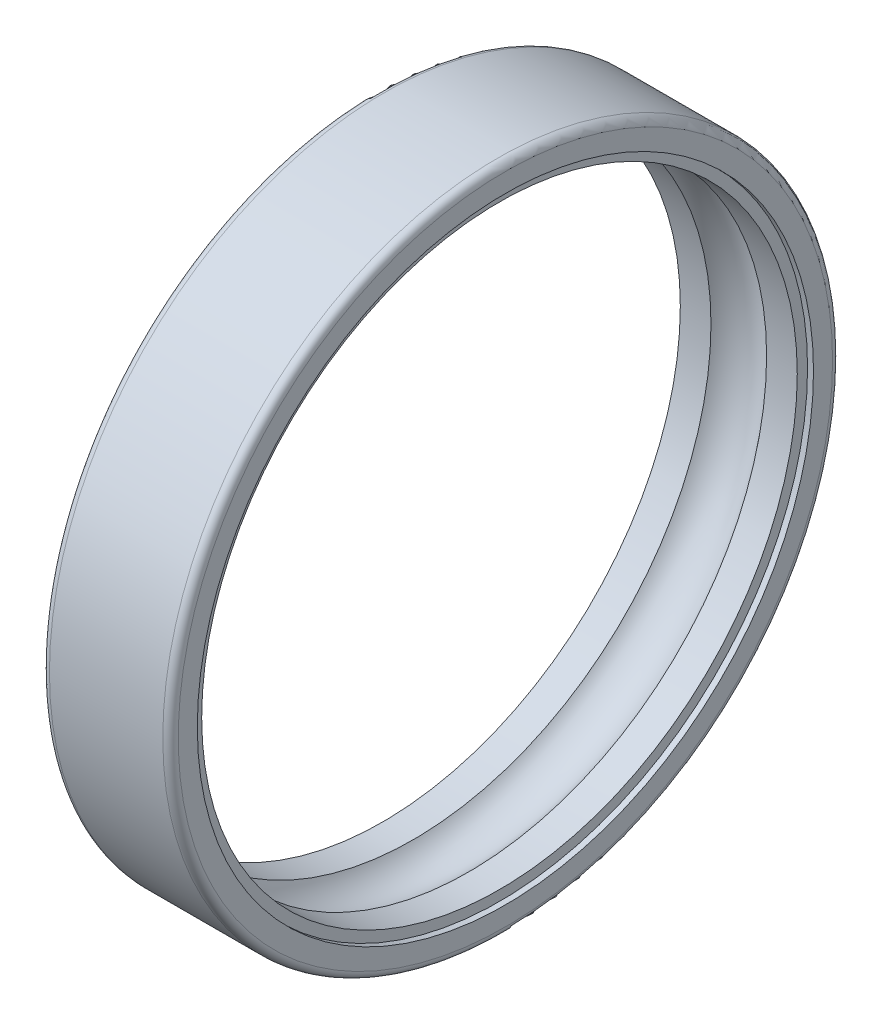
ISO-10303-21;
HEADER;
FILE_DESCRIPTION(('STEP AP214'),'2;1');
FILE_NAME('part.step','',(''),(''),'','','');
FILE_SCHEMA(('AUTOMOTIVE_DESIGN { 1 0 10303 214 1 1 1 1 }'));
ENDSEC;
DATA;
#1=APPLICATION_CONTEXT('core data for automotive mechanical design processes');
#2=APPLICATION_PROTOCOL_DEFINITION('international standard','automotive_design',2000,#1);
#3=PRODUCT_CONTEXT('',#1,'mechanical');
#4=PRODUCT('Part','Part','',(#3));
#5=PRODUCT_RELATED_PRODUCT_CATEGORY('part','',(#4));
#6=PRODUCT_DEFINITION_FORMATION('','',#4);
#7=PRODUCT_DEFINITION_CONTEXT('part definition',#1,'design');
#8=PRODUCT_DEFINITION('design','',#6,#7);
#9=PRODUCT_DEFINITION_SHAPE('','',#8);
#10=(LENGTH_UNIT() NAMED_UNIT(*) SI_UNIT(.MILLI.,.METRE.));
#11=(NAMED_UNIT(*) PLANE_ANGLE_UNIT() SI_UNIT($,.RADIAN.));
#12=(NAMED_UNIT(*) SI_UNIT($,.STERADIAN.) SOLID_ANGLE_UNIT());
#13=UNCERTAINTY_MEASURE_WITH_UNIT(LENGTH_MEASURE(1.E-05),#10,'distance_accuracy_value','');
#14=(GEOMETRIC_REPRESENTATION_CONTEXT(3) GLOBAL_UNCERTAINTY_ASSIGNED_CONTEXT((#13)) GLOBAL_UNIT_ASSIGNED_CONTEXT((#10,
#11,#12)) REPRESENTATION_CONTEXT('',''));
#15=CARTESIAN_POINT('',(0.,0.,0.));
#16=DIRECTION('',(0.,0.,1.));
#17=DIRECTION('',(1.,0.,0.));
#18=AXIS2_PLACEMENT_3D('',#15,#16,#17);
#19=CARTESIAN_POINT('',(0.23,11.425,0.));
#20=DIRECTION('',(1.,0.,0.));
#21=DIRECTION('',(0.,1.,0.));
#22=AXIS2_PLACEMENT_3D('',#19,#20,#21);
#23=PLANE('',#22);
#24=CARTESIAN_POINT('',(0.23,0.,0.));
#25=DIRECTION('',(1.,0.,0.));
#26=DIRECTION('',(0.,0.,-1.));
#27=AXIS2_PLACEMENT_3D('',#24,#25,#26);
#28=CIRCLE('',#27,11.56);
#29=CARTESIAN_POINT('',(0.23,0.,-11.56));
#30=VERTEX_POINT('',#29);
#31=EDGE_CURVE('E46',#30,#30,#28,.T.);
#32=ORIENTED_EDGE('',*,*,#31,.T.);
#33=EDGE_LOOP('',(#32));
#34=FACE_BOUND('',#33,.T.);
#35=CARTESIAN_POINT('',(0.23,0.,0.));
#36=DIRECTION('',(1.,0.,0.));
#37=DIRECTION('',(0.,0.,-1.));
#38=AXIS2_PLACEMENT_3D('',#35,#36,#37);
#39=CIRCLE('',#38,11.960005);
#40=CARTESIAN_POINT('',(0.23,0.,-11.960005));
#41=VERTEX_POINT('',#40);
#42=EDGE_CURVE('E10',#41,#41,#39,.T.);
#43=ORIENTED_EDGE('',*,*,#42,.F.);
#44=EDGE_LOOP('',(#43));
#45=FACE_BOUND('',#44,.T.);
#46=ADVANCED_FACE('F15',(#34,#45),#23,.F.);
#47=CARTESIAN_POINT('',(5.,0.,0.));
#48=DIRECTION('',(1.,0.,0.));
#49=DIRECTION('',(0.,0.,-1.));
#50=AXIS2_PLACEMENT_3D('',#47,#48,#49);
#51=CYLINDRICAL_SURFACE('',#50,11.960005);
#52=ORIENTED_EDGE('',*,*,#42,.T.);
#53=EDGE_LOOP('',(#52));
#54=FACE_BOUND('',#53,.T.);
#55=CARTESIAN_POINT('',(0.,0.,0.));
#56=DIRECTION('',(1.,0.,0.));
#57=DIRECTION('',(0.,0.,-1.));
#58=AXIS2_PLACEMENT_3D('',#55,#56,#57);
#59=CIRCLE('',#58,11.960005);
#60=CARTESIAN_POINT('',(0.,0.,-11.960005));
#61=VERTEX_POINT('',#60);
#62=EDGE_CURVE('E65',#61,#61,#59,.T.);
#63=ORIENTED_EDGE('',*,*,#62,.F.);
#64=EDGE_LOOP('',(#63));
#65=FACE_BOUND('',#64,.T.);
#66=ADVANCED_FACE('F17',(#54,#65),#51,.F.);
#67=CARTESIAN_POINT('',(5.,0.,0.));
#68=DIRECTION('',(1.,0.,0.));
#69=DIRECTION('',(0.,0.,-1.));
#70=AXIS2_PLACEMENT_3D('',#67,#68,#69);
#71=CYLINDRICAL_SURFACE('',#70,11.56);
#72=CARTESIAN_POINT('',(4.77,0.,0.));
#73=DIRECTION('',(-1.,0.,0.));
#74=DIRECTION('',(0.,0.,1.));
#75=AXIS2_PLACEMENT_3D('',#72,#73,#74);
#76=CIRCLE('',#75,11.56);
#77=CARTESIAN_POINT('',(4.77,0.,11.56));
#78=VERTEX_POINT('',#77);
#79=EDGE_CURVE('E42',#78,#78,#76,.T.);
#80=ORIENTED_EDGE('',*,*,#79,.F.);
#81=EDGE_LOOP('',(#80));
#82=FACE_BOUND('',#81,.T.);
#83=CARTESIAN_POINT('',(3.58,0.,0.));
#84=DIRECTION('',(1.,0.,0.));
#85=DIRECTION('',(0.,0.,-1.));
#86=AXIS2_PLACEMENT_3D('',#83,#84,#85);
#87=CIRCLE('',#86,11.56);
#88=CARTESIAN_POINT('',(3.58,0.,-11.56));
#89=VERTEX_POINT('',#88);
#90=EDGE_CURVE('E19',#89,#89,#87,.T.);
#91=ORIENTED_EDGE('',*,*,#90,.F.);
#92=EDGE_LOOP('',(#91));
#93=FACE_BOUND('',#92,.T.);
#94=ADVANCED_FACE('F111',(#82,#93),#71,.F.);
#95=CARTESIAN_POINT('',(2.5,0.,0.));
#96=DIRECTION('',(1.,0.,0.));
#97=DIRECTION('',(0.,0.,-1.));
#98=AXIS2_PLACEMENT_3D('',#95,#96,#97);
#99=TOROIDAL_SURFACE('',#98,10.75,1.35);
#100=ORIENTED_EDGE('',*,*,#90,.T.);
#101=EDGE_LOOP('',(#100));
#102=FACE_BOUND('',#101,.T.);
#103=CARTESIAN_POINT('',(1.42,0.,0.));
#104=DIRECTION('',(1.,0.,0.));
#105=DIRECTION('',(0.,0.,-1.));
#106=AXIS2_PLACEMENT_3D('',#103,#104,#105);
#107=CIRCLE('',#106,11.56);
#108=CARTESIAN_POINT('',(1.42,0.,-11.56));
#109=VERTEX_POINT('',#108);
#110=EDGE_CURVE('E33',#109,#109,#107,.T.);
#111=ORIENTED_EDGE('',*,*,#110,.F.);
#112=EDGE_LOOP('',(#111));
#113=FACE_BOUND('',#112,.T.);
#114=ADVANCED_FACE('F116',(#102,#113),#99,.F.);
#115=CARTESIAN_POINT('',(5.,0.,0.));
#116=DIRECTION('',(1.,0.,0.));
#117=DIRECTION('',(0.,0.,-1.));
#118=AXIS2_PLACEMENT_3D('',#115,#116,#117);
#119=CYLINDRICAL_SURFACE('',#118,11.56);
#120=ORIENTED_EDGE('',*,*,#110,.T.);
#121=EDGE_LOOP('',(#120));
#122=FACE_BOUND('',#121,.T.);
#123=ORIENTED_EDGE('',*,*,#31,.F.);
#124=EDGE_LOOP('',(#123));
#125=FACE_BOUND('',#124,.T.);
#126=ADVANCED_FACE('F118',(#122,#125),#119,.F.);
#127=CARTESIAN_POINT('',(4.77,11.960005,0.));
#128=DIRECTION('',(-1.,0.,0.));
#129=DIRECTION('',(0.,0.,1.));
#130=AXIS2_PLACEMENT_3D('',#127,#128,#129);
#131=PLANE('',#130);
#132=ORIENTED_EDGE('',*,*,#79,.T.);
#133=EDGE_LOOP('',(#132));
#134=FACE_BOUND('',#133,.T.);
#135=CARTESIAN_POINT('',(4.77,0.,0.));
#136=DIRECTION('',(1.,0.,0.));
#137=DIRECTION('',(0.,0.,-1.));
#138=AXIS2_PLACEMENT_3D('',#135,#136,#137);
#139=CIRCLE('',#138,11.960005);
#140=CARTESIAN_POINT('',(4.77,0.,-11.960005));
#141=VERTEX_POINT('',#140);
#142=EDGE_CURVE('E38',#141,#141,#139,.T.);
#143=ORIENTED_EDGE('',*,*,#142,.T.);
#144=EDGE_LOOP('',(#143));
#145=FACE_BOUND('',#144,.T.);
#146=ADVANCED_FACE('F121',(#134,#145),#131,.F.);
#147=CARTESIAN_POINT('',(5.,0.,0.));
#148=DIRECTION('',(1.,0.,0.));
#149=DIRECTION('',(0.,0.,-1.));
#150=AXIS2_PLACEMENT_3D('',#147,#148,#149);
#151=CYLINDRICAL_SURFACE('',#150,11.960005);
#152=CARTESIAN_POINT('',(5.,0.,0.));
#153=DIRECTION('',(1.,0.,0.));
#154=DIRECTION('',(0.,0.,-1.));
#155=AXIS2_PLACEMENT_3D('',#152,#153,#154);
#156=CIRCLE('',#155,11.960005);
#157=CARTESIAN_POINT('',(5.,0.,-11.960005));
#158=VERTEX_POINT('',#157);
#159=EDGE_CURVE('E73',#158,#158,#156,.T.);
#160=ORIENTED_EDGE('',*,*,#159,.T.);
#161=EDGE_LOOP('',(#160));
#162=FACE_BOUND('',#161,.T.);
#163=ORIENTED_EDGE('',*,*,#142,.F.);
#164=EDGE_LOOP('',(#163));
#165=FACE_BOUND('',#164,.T.);
#166=ADVANCED_FACE('F103',(#162,#165),#151,.F.);
#167=CARTESIAN_POINT('',(0.3,0.,0.));
#168=DIRECTION('',(1.,0.,0.));
#169=DIRECTION('',(0.,0.,-1.));
#170=AXIS2_PLACEMENT_3D('',#167,#168,#169);
#171=TOROIDAL_SURFACE('',#170,12.7,0.3);
#172=CARTESIAN_POINT('',(0.,0.,0.));
#173=DIRECTION('',(1.,0.,0.));
#174=DIRECTION('',(0.,0.,-1.));
#175=AXIS2_PLACEMENT_3D('',#172,#173,#174);
#176=CIRCLE('',#175,12.7);
#177=CARTESIAN_POINT('',(0.,0.,-12.7));
#178=VERTEX_POINT('',#177);
#179=EDGE_CURVE('E61',#178,#178,#176,.T.);
#180=ORIENTED_EDGE('',*,*,#179,.T.);
#181=EDGE_LOOP('',(#180));
#182=FACE_BOUND('',#181,.T.);
#183=CARTESIAN_POINT('',(0.3,0.,0.));
#184=DIRECTION('',(1.,0.,0.));
#185=DIRECTION('',(0.,0.,-1.));
#186=AXIS2_PLACEMENT_3D('',#183,#184,#185);
#187=CIRCLE('',#186,13.);
#188=CARTESIAN_POINT('',(0.3,0.,-13.));
#189=VERTEX_POINT('',#188);
#190=EDGE_CURVE('E43',#189,#189,#187,.T.);
#191=ORIENTED_EDGE('',*,*,#190,.F.);
#192=EDGE_LOOP('',(#191));
#193=FACE_BOUND('',#192,.T.);
#194=ADVANCED_FACE('F93',(#182,#193),#171,.T.);
#195=CARTESIAN_POINT('',(5.,0.,0.));
#196=DIRECTION('',(1.,0.,0.));
#197=DIRECTION('',(0.,0.,-1.));
#198=AXIS2_PLACEMENT_3D('',#195,#196,#197);
#199=CYLINDRICAL_SURFACE('',#198,13.);
#200=ORIENTED_EDGE('',*,*,#190,.T.);
#201=EDGE_LOOP('',(#200));
#202=FACE_BOUND('',#201,.T.);
#203=CARTESIAN_POINT('',(4.7,0.,0.));
#204=DIRECTION('',(1.,0.,0.));
#205=DIRECTION('',(0.,0.,-1.));
#206=AXIS2_PLACEMENT_3D('',#203,#204,#205);
#207=CIRCLE('',#206,13.);
#208=CARTESIAN_POINT('',(4.7,0.,-13.));
#209=VERTEX_POINT('',#208);
#210=EDGE_CURVE('E36',#209,#209,#207,.T.);
#211=ORIENTED_EDGE('',*,*,#210,.F.);
#212=EDGE_LOOP('',(#211));
#213=FACE_BOUND('',#212,.T.);
#214=ADVANCED_FACE('F91',(#202,#213),#199,.T.);
#215=CARTESIAN_POINT('',(4.7,0.,0.));
#216=DIRECTION('',(1.,0.,0.));
#217=DIRECTION('',(0.,0.,-1.));
#218=AXIS2_PLACEMENT_3D('',#215,#216,#217);
#219=TOROIDAL_SURFACE('',#218,12.7,0.3);
#220=ORIENTED_EDGE('',*,*,#210,.T.);
#221=EDGE_LOOP('',(#220));
#222=FACE_BOUND('',#221,.T.);
#223=CARTESIAN_POINT('',(5.,0.,0.));
#224=DIRECTION('',(1.,0.,0.));
#225=DIRECTION('',(0.,0.,-1.));
#226=AXIS2_PLACEMENT_3D('',#223,#224,#225);
#227=CIRCLE('',#226,12.7);
#228=CARTESIAN_POINT('',(5.,0.,-12.7));
#229=VERTEX_POINT('',#228);
#230=EDGE_CURVE('E69',#229,#229,#227,.T.);
#231=ORIENTED_EDGE('',*,*,#230,.F.);
#232=EDGE_LOOP('',(#231));
#233=FACE_BOUND('',#232,.T.);
#234=ADVANCED_FACE('F88',(#222,#233),#219,.T.);
#235=CARTESIAN_POINT('',(5.,11.56,0.));
#236=DIRECTION('',(1.,0.,0.));
#237=DIRECTION('',(0.,1.,0.));
#238=AXIS2_PLACEMENT_3D('',#235,#236,#237);
#239=PLANE('',#238);
#240=ORIENTED_EDGE('',*,*,#159,.F.);
#241=EDGE_LOOP('',(#240));
#242=FACE_BOUND('',#241,.T.);
#243=ORIENTED_EDGE('',*,*,#230,.T.);
#244=EDGE_LOOP('',(#243));
#245=FACE_BOUND('',#244,.T.);
#246=ADVANCED_FACE('F101',(#242,#245),#239,.T.);
#247=CARTESIAN_POINT('',(0.,12.7,0.));
#248=DIRECTION('',(-1.,0.,0.));
#249=DIRECTION('',(0.,0.,1.));
#250=AXIS2_PLACEMENT_3D('',#247,#248,#249);
#251=PLANE('',#250);
#252=ORIENTED_EDGE('',*,*,#62,.T.);
#253=EDGE_LOOP('',(#252));
#254=FACE_BOUND('',#253,.T.);
#255=ORIENTED_EDGE('',*,*,#179,.F.);
#256=EDGE_LOOP('',(#255));
#257=FACE_BOUND('',#256,.T.);
#258=ADVANCED_FACE('F166',(#254,#257),#251,.T.);
#259=CLOSED_SHELL('',(#46,#66,#94,#114,#126,#146,#166,#194,#214,#234,#246,#258));
#260=MANIFOLD_SOLID_BREP('B1',#259);
#261=ADVANCED_BREP_SHAPE_REPRESENTATION('',(#18,#260),#14);
#262=SHAPE_DEFINITION_REPRESENTATION(#9,#261);
ENDSEC;
END-ISO-10303-21;
